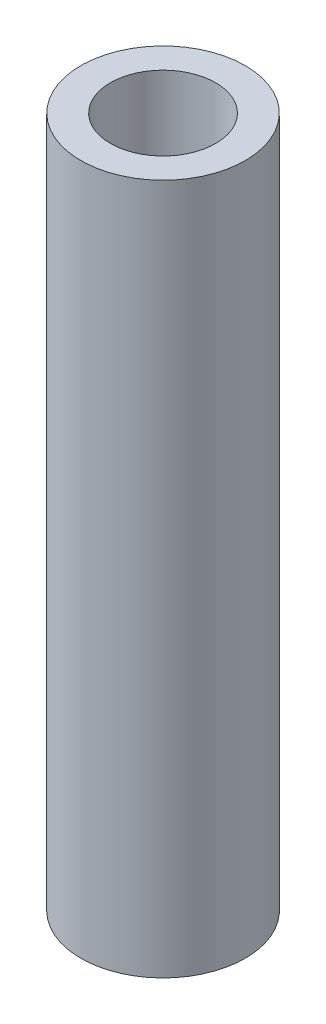
ISO-10303-21;
HEADER;
FILE_DESCRIPTION(('STEP AP214'),'2;1');
FILE_NAME('part.step','',(''),(''),'','','');
FILE_SCHEMA(('AUTOMOTIVE_DESIGN { 1 0 10303 214 1 1 1 1 }'));
ENDSEC;
DATA;
#1=APPLICATION_CONTEXT('core data for automotive mechanical design processes');
#2=APPLICATION_PROTOCOL_DEFINITION('international standard','automotive_design',2000,#1);
#3=PRODUCT_CONTEXT('',#1,'mechanical');
#4=PRODUCT('Part','Part','',(#3));
#5=PRODUCT_RELATED_PRODUCT_CATEGORY('part','',(#4));
#6=PRODUCT_DEFINITION_FORMATION('','',#4);
#7=PRODUCT_DEFINITION_CONTEXT('part definition',#1,'design');
#8=PRODUCT_DEFINITION('design','',#6,#7);
#9=PRODUCT_DEFINITION_SHAPE('','',#8);
#10=(LENGTH_UNIT() NAMED_UNIT(*) SI_UNIT(.MILLI.,.METRE.));
#11=(NAMED_UNIT(*) PLANE_ANGLE_UNIT() SI_UNIT($,.RADIAN.));
#12=(NAMED_UNIT(*) SI_UNIT($,.STERADIAN.) SOLID_ANGLE_UNIT());
#13=UNCERTAINTY_MEASURE_WITH_UNIT(LENGTH_MEASURE(1.E-05),#10,'distance_accuracy_value','');
#14=(GEOMETRIC_REPRESENTATION_CONTEXT(3) GLOBAL_UNCERTAINTY_ASSIGNED_CONTEXT((#13)) GLOBAL_UNIT_ASSIGNED_CONTEXT((#10,
#11,#12)) REPRESENTATION_CONTEXT('',''));
#15=CARTESIAN_POINT('',(0.,0.,0.));
#16=DIRECTION('',(0.,0.,1.));
#17=DIRECTION('',(1.,0.,0.));
#18=AXIS2_PLACEMENT_3D('',#15,#16,#17);
#19=CARTESIAN_POINT('',(0.,10.5,0.));
#20=DIRECTION('',(0.,-1.,0.));
#21=DIRECTION('',(0.,0.,-1.));
#22=AXIS2_PLACEMENT_3D('',#19,#20,#21);
#23=CYLINDRICAL_SURFACE('',#22,2.5);
#24=CARTESIAN_POINT('',(0.,10.5,0.));
#25=DIRECTION('',(0.,1.,0.));
#26=DIRECTION('',(0.,0.,1.));
#27=AXIS2_PLACEMENT_3D('',#24,#25,#26);
#28=CIRCLE('',#27,2.5);
#29=CARTESIAN_POINT('',(0.,10.5,-2.5));
#30=VERTEX_POINT('',#29);
#31=EDGE_CURVE('E10',#30,#30,#28,.T.);
#32=CARTESIAN_POINT('',(0.,-10.5,0.));
#33=DIRECTION('',(0.,1.,0.));
#34=DIRECTION('',(0.,0.,1.));
#35=AXIS2_PLACEMENT_3D('',#32,#33,#34);
#36=CIRCLE('',#35,2.5);
#37=CARTESIAN_POINT('',(0.,-10.5,-2.5));
#38=VERTEX_POINT('',#37);
#39=EDGE_CURVE('E44',#38,#38,#36,.T.);
#40=CARTESIAN_POINT('',(0.,10.5,-2.5));
#41=CARTESIAN_POINT('',(0.,10.28125,-2.5));
#42=CARTESIAN_POINT('',(0.,10.0625,-2.5));
#43=CARTESIAN_POINT('',(0.,9.625,-2.5));
#44=CARTESIAN_POINT('',(0.,9.40625,-2.5));
#45=CARTESIAN_POINT('',(0.,8.96875,-2.5));
#46=CARTESIAN_POINT('',(0.,8.75,-2.5));
#47=CARTESIAN_POINT('',(0.,8.3125,-2.5));
#48=CARTESIAN_POINT('',(0.,8.09375,-2.5));
#49=CARTESIAN_POINT('',(0.,7.65625,-2.5));
#50=CARTESIAN_POINT('',(0.,7.4375,-2.5));
#51=CARTESIAN_POINT('',(0.,7.,-2.5));
#52=CARTESIAN_POINT('',(0.,6.78125,-2.5));
#53=CARTESIAN_POINT('',(0.,6.34375,-2.5));
#54=CARTESIAN_POINT('',(0.,6.125,-2.5));
#55=CARTESIAN_POINT('',(0.,5.6875,-2.5));
#56=CARTESIAN_POINT('',(0.,5.46875,-2.5));
#57=CARTESIAN_POINT('',(0.,5.03125,-2.5));
#58=CARTESIAN_POINT('',(0.,4.8125,-2.5));
#59=CARTESIAN_POINT('',(0.,4.375,-2.5));
#60=CARTESIAN_POINT('',(0.,4.15625,-2.5));
#61=CARTESIAN_POINT('',(0.,3.71875,-2.5));
#62=CARTESIAN_POINT('',(0.,3.5,-2.5));
#63=CARTESIAN_POINT('',(0.,3.0625,-2.5));
#64=CARTESIAN_POINT('',(0.,2.84375,-2.5));
#65=CARTESIAN_POINT('',(0.,2.40625,-2.5));
#66=CARTESIAN_POINT('',(0.,2.1875,-2.5));
#67=CARTESIAN_POINT('',(0.,1.75,-2.5));
#68=CARTESIAN_POINT('',(0.,1.53125,-2.5));
#69=CARTESIAN_POINT('',(0.,1.09375,-2.5));
#70=CARTESIAN_POINT('',(0.,0.875000000000001,-2.5));
#71=CARTESIAN_POINT('',(0.,0.4375,-2.5));
#72=CARTESIAN_POINT('',(0.,0.21875,-2.5));
#73=CARTESIAN_POINT('',(0.,-0.21875,-2.5));
#74=CARTESIAN_POINT('',(0.,-0.4375,-2.5));
#75=CARTESIAN_POINT('',(0.,-0.875000000000001,-2.5));
#76=CARTESIAN_POINT('',(0.,-1.09375,-2.5));
#77=CARTESIAN_POINT('',(0.,-1.53125,-2.5));
#78=CARTESIAN_POINT('',(0.,-1.75,-2.5));
#79=CARTESIAN_POINT('',(0.,-2.1875,-2.5));
#80=CARTESIAN_POINT('',(0.,-2.40625,-2.5));
#81=CARTESIAN_POINT('',(0.,-2.84375,-2.5));
#82=CARTESIAN_POINT('',(0.,-3.0625,-2.5));
#83=CARTESIAN_POINT('',(0.,-3.5,-2.5));
#84=CARTESIAN_POINT('',(0.,-3.71875,-2.5));
#85=CARTESIAN_POINT('',(0.,-4.15625,-2.5));
#86=CARTESIAN_POINT('',(0.,-4.375,-2.5));
#87=CARTESIAN_POINT('',(0.,-4.8125,-2.5));
#88=CARTESIAN_POINT('',(0.,-5.03125,-2.5));
#89=CARTESIAN_POINT('',(0.,-5.46875,-2.5));
#90=CARTESIAN_POINT('',(0.,-5.6875,-2.5));
#91=CARTESIAN_POINT('',(0.,-6.125,-2.5));
#92=CARTESIAN_POINT('',(0.,-6.34375,-2.5));
#93=CARTESIAN_POINT('',(0.,-6.78125,-2.5));
#94=CARTESIAN_POINT('',(0.,-7.,-2.5));
#95=CARTESIAN_POINT('',(0.,-7.4375,-2.5));
#96=CARTESIAN_POINT('',(0.,-7.65625,-2.5));
#97=CARTESIAN_POINT('',(0.,-8.09375,-2.5));
#98=CARTESIAN_POINT('',(0.,-8.3125,-2.5));
#99=CARTESIAN_POINT('',(0.,-8.75,-2.5));
#100=CARTESIAN_POINT('',(0.,-8.96875,-2.5));
#101=CARTESIAN_POINT('',(0.,-9.40625,-2.5));
#102=CARTESIAN_POINT('',(0.,-9.625,-2.5));
#103=CARTESIAN_POINT('',(0.,-10.0625,-2.5));
#104=CARTESIAN_POINT('',(0.,-10.28125,-2.5));
#105=CARTESIAN_POINT('',(0.,-10.5,-2.5));
#106=B_SPLINE_CURVE_WITH_KNOTS('',3,(#40,#41,#42,#43,#44,#45,#46,#47,#48,#49,#50,#51,#52,#53,
#54,#55,#56,#57,#58,#59,#60,#61,#62,#63,#64,#65,#66,#67,#68,#69,#70,#71,#72,#73,#74,#75,#76,#77,
#78,#79,#80,#81,#82,#83,#84,#85,#86,#87,#88,#89,#90,#91,#92,#93,#94,#95,#96,#97,#98,#99,#100,
#101,#102,#103,#104,#105),.UNSPECIFIED.,.F.,.F.,(4,2,2,2,2,2,2,2,2,2,2,2,2,2,2,2,2,2,2,2,2,2,2,
2,2,2,2,2,2,2,2,2,4),(0.,0.656250000000001,1.3125,1.96875,2.625,3.28125,3.9375,4.59375,5.25,
5.90625,6.5625,7.21875,7.875,8.53125,9.1875,9.84375,10.5,11.15625,11.8125,12.46875,13.125,
13.78125,14.4375,15.09375,15.75,16.40625,17.0625,17.71875,18.375,19.03125,19.6875,20.34375,21.),.UNSPECIFIED.);
#107=EDGE_CURVE('BSEAM41',#30,#38,#106,.T.);
#108=ORIENTED_EDGE('',*,*,#31,.F.);
#109=ORIENTED_EDGE('',*,*,#39,.T.);
#110=ORIENTED_EDGE('',*,*,#107,.T.);
#111=ORIENTED_EDGE('',*,*,#107,.F.);
#112=EDGE_LOOP('',(#108,#110,#109,#111));
#113=FACE_BOUND('',#112,.T.);
#114=ADVANCED_FACE('F41',(#113),#23,.T.);
#115=CARTESIAN_POINT('',(0.,10.5,0.));
#116=DIRECTION('',(0.,1.,0.));
#117=DIRECTION('',(0.,0.,1.));
#118=AXIS2_PLACEMENT_3D('',#115,#116,#117);
#119=PLANE('',#118);
#120=CARTESIAN_POINT('',(0.,10.5,0.));
#121=DIRECTION('',(0.,1.,0.));
#122=DIRECTION('',(0.,0.,1.));
#123=AXIS2_PLACEMENT_3D('',#120,#121,#122);
#124=CIRCLE('',#123,1.59999999999999);
#125=CARTESIAN_POINT('',(0.,10.5,1.59999999999999));
#126=VERTEX_POINT('',#125);
#127=EDGE_CURVE('E58',#126,#126,#124,.T.);
#128=ORIENTED_EDGE('',*,*,#127,.F.);
#129=EDGE_LOOP('',(#128));
#130=FACE_BOUND('',#129,.T.);
#131=ORIENTED_EDGE('',*,*,#31,.T.);
#132=EDGE_LOOP('',(#131));
#133=FACE_BOUND('',#132,.T.);
#134=ADVANCED_FACE('F65',(#130,#133),#119,.T.);
#135=CARTESIAN_POINT('',(0.,-10.5,0.));
#136=DIRECTION('',(0.,1.,0.));
#137=DIRECTION('',(0.,0.,1.));
#138=AXIS2_PLACEMENT_3D('',#135,#136,#137);
#139=PLANE('',#138);
#140=CARTESIAN_POINT('',(0.,-10.5,0.));
#141=DIRECTION('',(0.,1.,0.));
#142=DIRECTION('',(0.,0.,1.));
#143=AXIS2_PLACEMENT_3D('',#140,#141,#142);
#144=CIRCLE('',#143,1.59999999999999);
#145=CARTESIAN_POINT('',(0.,-10.5,1.59999999999999));
#146=VERTEX_POINT('',#145);
#147=EDGE_CURVE('E53',#146,#146,#144,.T.);
#148=ORIENTED_EDGE('',*,*,#147,.T.);
#149=EDGE_LOOP('',(#148));
#150=FACE_BOUND('',#149,.T.);
#151=ORIENTED_EDGE('',*,*,#39,.F.);
#152=EDGE_LOOP('',(#151));
#153=FACE_BOUND('',#152,.T.);
#154=ADVANCED_FACE('F67',(#150,#153),#139,.F.);
#155=CARTESIAN_POINT('',(0.,10.5,0.));
#156=DIRECTION('',(0.,1.,0.));
#157=DIRECTION('',(0.,0.,1.));
#158=AXIS2_PLACEMENT_3D('',#155,#156,#157);
#159=CYLINDRICAL_SURFACE('',#158,1.59999999999999);
#160=ORIENTED_EDGE('',*,*,#147,.F.);
#161=EDGE_LOOP('',(#160));
#162=FACE_BOUND('',#161,.T.);
#163=ORIENTED_EDGE('',*,*,#127,.T.);
#164=EDGE_LOOP('',(#163));
#165=FACE_BOUND('',#164,.T.);
#166=ADVANCED_FACE('F63',(#162,#165),#159,.F.);
#167=CLOSED_SHELL('',(#114,#134,#154,#166));
#168=MANIFOLD_SOLID_BREP('B2',#167);
#169=ADVANCED_BREP_SHAPE_REPRESENTATION('',(#18,#168),#14);
#170=SHAPE_DEFINITION_REPRESENTATION(#9,#169);
ENDSEC;
END-ISO-10303-21;
